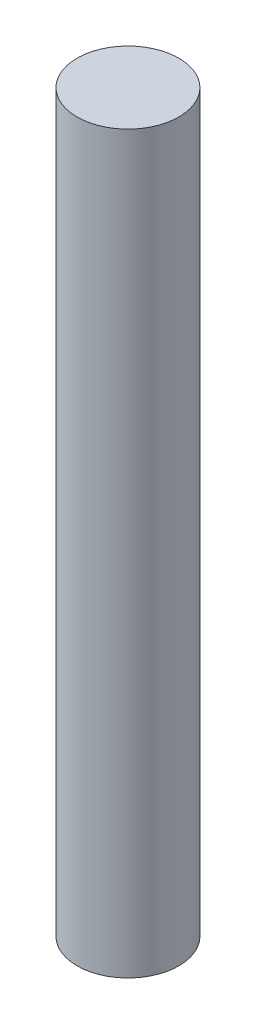
ISO-10303-21;
HEADER;
FILE_DESCRIPTION(('STEP AP214'),'2;1');
FILE_NAME('part.step','',(''),(''),'','','');
FILE_SCHEMA(('AUTOMOTIVE_DESIGN { 1 0 10303 214 1 1 1 1 }'));
ENDSEC;
DATA;
#1=APPLICATION_CONTEXT('core data for automotive mechanical design processes');
#2=APPLICATION_PROTOCOL_DEFINITION('international standard','automotive_design',2000,#1);
#3=PRODUCT_CONTEXT('',#1,'mechanical');
#4=PRODUCT('Part','Part','',(#3));
#5=PRODUCT_RELATED_PRODUCT_CATEGORY('part','',(#4));
#6=PRODUCT_DEFINITION_FORMATION('','',#4);
#7=PRODUCT_DEFINITION_CONTEXT('part definition',#1,'design');
#8=PRODUCT_DEFINITION('design','',#6,#7);
#9=PRODUCT_DEFINITION_SHAPE('','',#8);
#10=(LENGTH_UNIT() NAMED_UNIT(*) SI_UNIT(.MILLI.,.METRE.));
#11=(NAMED_UNIT(*) PLANE_ANGLE_UNIT() SI_UNIT($,.RADIAN.));
#12=(NAMED_UNIT(*) SI_UNIT($,.STERADIAN.) SOLID_ANGLE_UNIT());
#13=UNCERTAINTY_MEASURE_WITH_UNIT(LENGTH_MEASURE(1.E-05),#10,'distance_accuracy_value','');
#14=(GEOMETRIC_REPRESENTATION_CONTEXT(3) GLOBAL_UNCERTAINTY_ASSIGNED_CONTEXT((#13)) GLOBAL_UNIT_ASSIGNED_CONTEXT((#10,
#11,#12)) REPRESENTATION_CONTEXT('',''));
#15=CARTESIAN_POINT('',(0.,0.,0.));
#16=DIRECTION('',(0.,0.,1.));
#17=DIRECTION('',(1.,0.,0.));
#18=AXIS2_PLACEMENT_3D('',#15,#16,#17);
#19=CARTESIAN_POINT('',(0.,709.676,0.));
#20=DIRECTION('',(0.,-1.,0.));
#21=DIRECTION('',(0.,0.,-1.));
#22=AXIS2_PLACEMENT_3D('',#19,#20,#21);
#23=CYLINDRICAL_SURFACE('',#22,49.149);
#24=CARTESIAN_POINT('',(0.,709.676,0.));
#25=DIRECTION('',(0.,1.,0.));
#26=DIRECTION('',(0.,0.,1.));
#27=AXIS2_PLACEMENT_3D('',#24,#25,#26);
#28=CIRCLE('',#27,49.149);
#29=CARTESIAN_POINT('',(0.,709.676,49.149));
#30=VERTEX_POINT('',#29);
#31=EDGE_CURVE('E10',#30,#30,#28,.T.);
#32=ORIENTED_EDGE('',*,*,#31,.F.);
#33=EDGE_LOOP('',(#32));
#34=FACE_BOUND('',#33,.T.);
#35=CARTESIAN_POINT('',(0.,0.,0.));
#36=DIRECTION('',(0.,1.,0.));
#37=DIRECTION('',(0.,0.,1.));
#38=AXIS2_PLACEMENT_3D('',#35,#36,#37);
#39=CIRCLE('',#38,49.149);
#40=CARTESIAN_POINT('',(0.,0.,49.149));
#41=VERTEX_POINT('',#40);
#42=EDGE_CURVE('E40',#41,#41,#39,.T.);
#43=ORIENTED_EDGE('',*,*,#42,.T.);
#44=EDGE_LOOP('',(#43));
#45=FACE_BOUND('',#44,.T.);
#46=ADVANCED_FACE('F37',(#34,#45),#23,.T.);
#47=CARTESIAN_POINT('',(0.,709.676,0.));
#48=DIRECTION('',(0.,1.,0.));
#49=DIRECTION('',(0.,0.,1.));
#50=AXIS2_PLACEMENT_3D('',#47,#48,#49);
#51=PLANE('',#50);
#52=ORIENTED_EDGE('',*,*,#31,.T.);
#53=EDGE_LOOP('',(#52));
#54=FACE_BOUND('',#53,.T.);
#55=ADVANCED_FACE('F54',(#54),#51,.T.);
#56=CARTESIAN_POINT('',(0.,0.,0.));
#57=DIRECTION('',(0.,1.,0.));
#58=DIRECTION('',(0.,0.,1.));
#59=AXIS2_PLACEMENT_3D('',#56,#57,#58);
#60=PLANE('',#59);
#61=ORIENTED_EDGE('',*,*,#42,.F.);
#62=EDGE_LOOP('',(#61));
#63=FACE_BOUND('',#62,.T.);
#64=ADVANCED_FACE('F52',(#63),#60,.F.);
#65=CLOSED_SHELL('',(#46,#55,#64));
#66=MANIFOLD_SOLID_BREP('B2',#65);
#67=ADVANCED_BREP_SHAPE_REPRESENTATION('',(#18,#66),#14);
#68=SHAPE_DEFINITION_REPRESENTATION(#9,#67);
ENDSEC;
END-ISO-10303-21;
